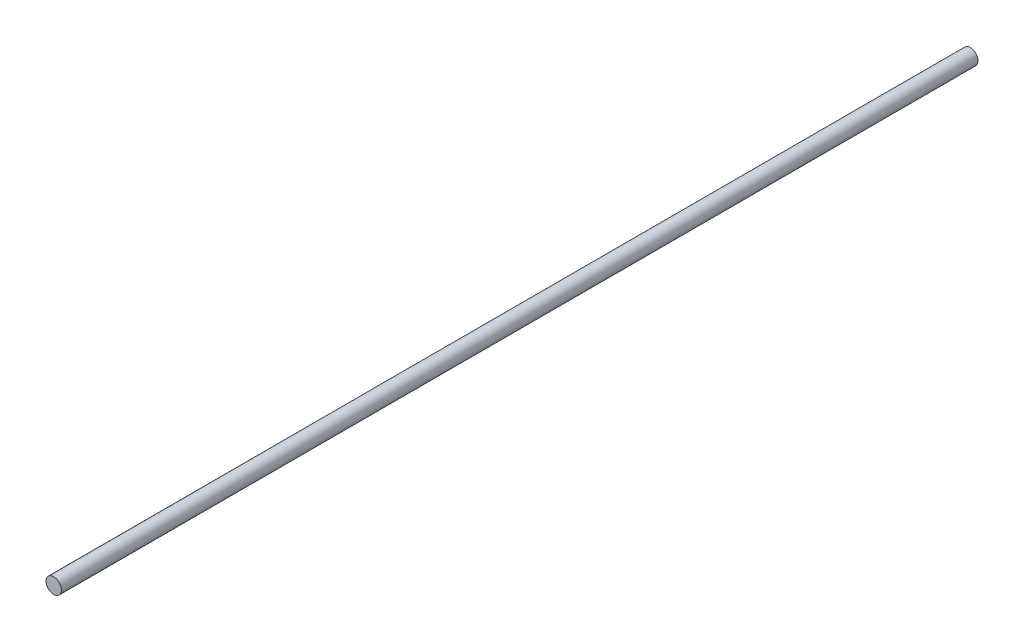
ISO-10303-21;
HEADER;
FILE_DESCRIPTION(('STEP AP214'),'2;1');
FILE_NAME('part.step','',(''),(''),'','','');
FILE_SCHEMA(('AUTOMOTIVE_DESIGN { 1 0 10303 214 1 1 1 1 }'));
ENDSEC;
DATA;
#1=APPLICATION_CONTEXT('core data for automotive mechanical design processes');
#2=APPLICATION_PROTOCOL_DEFINITION('international standard','automotive_design',2000,#1);
#3=PRODUCT_CONTEXT('',#1,'mechanical');
#4=PRODUCT('Part','Part','',(#3));
#5=PRODUCT_RELATED_PRODUCT_CATEGORY('part','',(#4));
#6=PRODUCT_DEFINITION_FORMATION('','',#4);
#7=PRODUCT_DEFINITION_CONTEXT('part definition',#1,'design');
#8=PRODUCT_DEFINITION('design','',#6,#7);
#9=PRODUCT_DEFINITION_SHAPE('','',#8);
#10=(LENGTH_UNIT() NAMED_UNIT(*) SI_UNIT(.MILLI.,.METRE.));
#11=(NAMED_UNIT(*) PLANE_ANGLE_UNIT() SI_UNIT($,.RADIAN.));
#12=(NAMED_UNIT(*) SI_UNIT($,.STERADIAN.) SOLID_ANGLE_UNIT());
#13=UNCERTAINTY_MEASURE_WITH_UNIT(LENGTH_MEASURE(1.E-05),#10,'distance_accuracy_value','');
#14=(GEOMETRIC_REPRESENTATION_CONTEXT(3) GLOBAL_UNCERTAINTY_ASSIGNED_CONTEXT((#13)) GLOBAL_UNIT_ASSIGNED_CONTEXT((#10,
#11,#12)) REPRESENTATION_CONTEXT('',''));
#15=CARTESIAN_POINT('',(0.,0.,0.));
#16=DIRECTION('',(0.,0.,1.));
#17=DIRECTION('',(1.,0.,0.));
#18=AXIS2_PLACEMENT_3D('',#15,#16,#17);
#19=CARTESIAN_POINT('',(0.,0.,95.25));
#20=DIRECTION('',(0.,0.,-1.));
#21=DIRECTION('',(-1.,0.,0.));
#22=AXIS2_PLACEMENT_3D('',#19,#20,#21);
#23=CYLINDRICAL_SURFACE('',#22,0.8001);
#24=CARTESIAN_POINT('',(0.,0.,95.25));
#25=DIRECTION('',(0.,0.,1.));
#26=DIRECTION('',(1.,0.,0.));
#27=AXIS2_PLACEMENT_3D('',#24,#25,#26);
#28=CIRCLE('',#27,0.8001);
#29=CARTESIAN_POINT('',(0.8001,0.,95.25));
#30=VERTEX_POINT('',#29);
#31=EDGE_CURVE('E10',#30,#30,#28,.T.);
#32=ORIENTED_EDGE('',*,*,#31,.F.);
#33=EDGE_LOOP('',(#32));
#34=FACE_BOUND('',#33,.T.);
#35=CARTESIAN_POINT('',(0.,0.,0.));
#36=DIRECTION('',(0.,0.,1.));
#37=DIRECTION('',(1.,0.,0.));
#38=AXIS2_PLACEMENT_3D('',#35,#36,#37);
#39=CIRCLE('',#38,0.8001);
#40=CARTESIAN_POINT('',(0.8001,0.,0.));
#41=VERTEX_POINT('',#40);
#42=EDGE_CURVE('E31',#41,#41,#39,.T.);
#43=ORIENTED_EDGE('',*,*,#42,.T.);
#44=EDGE_LOOP('',(#43));
#45=FACE_BOUND('',#44,.T.);
#46=ADVANCED_FACE('F28',(#34,#45),#23,.T.);
#47=CARTESIAN_POINT('',(0.,0.,95.25));
#48=DIRECTION('',(0.,0.,1.));
#49=DIRECTION('',(1.,0.,0.));
#50=AXIS2_PLACEMENT_3D('',#47,#48,#49);
#51=PLANE('',#50);
#52=ORIENTED_EDGE('',*,*,#31,.T.);
#53=EDGE_LOOP('',(#52));
#54=FACE_BOUND('',#53,.T.);
#55=ADVANCED_FACE('F43',(#54),#51,.T.);
#56=CARTESIAN_POINT('',(0.,0.,0.));
#57=DIRECTION('',(0.,0.,1.));
#58=DIRECTION('',(1.,0.,0.));
#59=AXIS2_PLACEMENT_3D('',#56,#57,#58);
#60=PLANE('',#59);
#61=ORIENTED_EDGE('',*,*,#42,.F.);
#62=EDGE_LOOP('',(#61));
#63=FACE_BOUND('',#62,.T.);
#64=ADVANCED_FACE('F41',(#63),#60,.F.);
#65=CLOSED_SHELL('',(#46,#55,#64));
#66=MANIFOLD_SOLID_BREP('B2',#65);
#67=ADVANCED_BREP_SHAPE_REPRESENTATION('',(#18,#66),#14);
#68=SHAPE_DEFINITION_REPRESENTATION(#9,#67);
ENDSEC;
END-ISO-10303-21;
